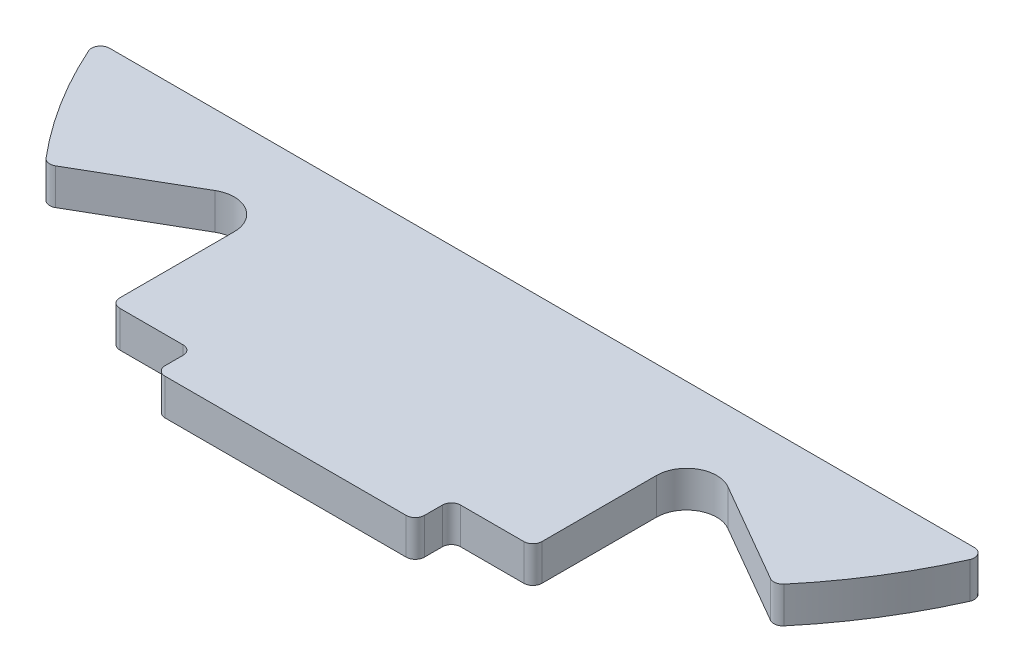
ISO-10303-21;
HEADER;
FILE_DESCRIPTION(('STEP AP214'),'2;1');
FILE_NAME('part.step','',(''),(''),'','','');
FILE_SCHEMA(('AUTOMOTIVE_DESIGN { 1 0 10303 214 1 1 1 1 }'));
ENDSEC;
DATA;
#1=APPLICATION_CONTEXT('core data for automotive mechanical design processes');
#2=APPLICATION_PROTOCOL_DEFINITION('international standard','automotive_design',2000,#1);
#3=PRODUCT_CONTEXT('',#1,'mechanical');
#4=PRODUCT('Part','Part','',(#3));
#5=PRODUCT_RELATED_PRODUCT_CATEGORY('part','',(#4));
#6=PRODUCT_DEFINITION_FORMATION('','',#4);
#7=PRODUCT_DEFINITION_CONTEXT('part definition',#1,'design');
#8=PRODUCT_DEFINITION('design','',#6,#7);
#9=PRODUCT_DEFINITION_SHAPE('','',#8);
#10=(LENGTH_UNIT() NAMED_UNIT(*) SI_UNIT(.MILLI.,.METRE.));
#11=(NAMED_UNIT(*) PLANE_ANGLE_UNIT() SI_UNIT($,.RADIAN.));
#12=(NAMED_UNIT(*) SI_UNIT($,.STERADIAN.) SOLID_ANGLE_UNIT());
#13=UNCERTAINTY_MEASURE_WITH_UNIT(LENGTH_MEASURE(1.E-05),#10,'distance_accuracy_value','');
#14=(GEOMETRIC_REPRESENTATION_CONTEXT(3) GLOBAL_UNCERTAINTY_ASSIGNED_CONTEXT((#13)) GLOBAL_UNIT_ASSIGNED_CONTEXT((#10,
#11,#12)) REPRESENTATION_CONTEXT('',''));
#15=CARTESIAN_POINT('',(0.,0.,0.));
#16=DIRECTION('',(0.,0.,1.));
#17=DIRECTION('',(1.,0.,0.));
#18=AXIS2_PLACEMENT_3D('',#15,#16,#17);
#19=CARTESIAN_POINT('',(43.,12.,0.));
#20=DIRECTION('',(0.,0.,-1.));
#21=DIRECTION('',(-1.,0.,0.));
#22=AXIS2_PLACEMENT_3D('',#19,#20,#21);
#23=PLANE('',#22);
#24=DIRECTION('',(1.,0.,0.));
#25=VECTOR('',#24,1.);
#26=CARTESIAN_POINT('',(43.,0.,0.));
#27=LINE('',#26,#25);
#28=CARTESIAN_POINT('',(-40.,0.,0.));
#29=VERTEX_POINT('',#28);
#30=CARTESIAN_POINT('',(40.,0.,0.));
#31=VERTEX_POINT('',#30);
#32=EDGE_CURVE('E288',#29,#31,#27,.T.);
#33=ORIENTED_EDGE('',*,*,#32,.T.);
#34=DIRECTION('',(0.,-1.,0.));
#35=VECTOR('',#34,1.);
#36=CARTESIAN_POINT('',(40.,12.,0.));
#37=LINE('',#36,#35);
#38=CARTESIAN_POINT('',(40.,12.,0.));
#39=VERTEX_POINT('',#38);
#40=EDGE_CURVE('E371',#31,#39,#37,.F.);
#41=ORIENTED_EDGE('',*,*,#40,.T.);
#42=DIRECTION('',(1.,0.,0.));
#43=VECTOR('',#42,1.);
#44=CARTESIAN_POINT('',(43.,12.,0.));
#45=LINE('',#44,#43);
#46=CARTESIAN_POINT('',(-40.,12.,0.));
#47=VERTEX_POINT('',#46);
#48=EDGE_CURVE('E289',#47,#39,#45,.T.);
#49=ORIENTED_EDGE('',*,*,#48,.F.);
#50=DIRECTION('',(0.,-1.,0.));
#51=VECTOR('',#50,1.);
#52=CARTESIAN_POINT('',(-40.,12.,0.));
#53=LINE('',#52,#51);
#54=EDGE_CURVE('E281',#29,#47,#53,.F.);
#55=ORIENTED_EDGE('',*,*,#54,.F.);
#56=EDGE_LOOP('',(#33,#41,#49,#55));
#57=FACE_BOUND('',#56,.T.);
#58=ADVANCED_FACE('F38',(#57),#23,.F.);
#59=CARTESIAN_POINT('',(43.,12.,-12.));
#60=DIRECTION('',(-1.,0.,0.));
#61=DIRECTION('',(0.,0.,1.));
#62=AXIS2_PLACEMENT_3D('',#59,#60,#61);
#63=PLANE('',#62);
#64=DIRECTION('',(0.,0.,-1.));
#65=VECTOR('',#64,1.);
#66=CARTESIAN_POINT('',(43.,0.,-12.));
#67=LINE('',#66,#65);
#68=CARTESIAN_POINT('',(43.,0.,-3.));
#69=VERTEX_POINT('',#68);
#70=CARTESIAN_POINT('',(43.,0.,-9.));
#71=VERTEX_POINT('',#70);
#72=EDGE_CURVE('E310',#69,#71,#67,.T.);
#73=ORIENTED_EDGE('',*,*,#72,.T.);
#74=DIRECTION('',(0.,-1.,0.));
#75=VECTOR('',#74,1.);
#76=CARTESIAN_POINT('',(43.,12.,-9.));
#77=LINE('',#76,#75);
#78=CARTESIAN_POINT('',(43.,12.,-9.));
#79=VERTEX_POINT('',#78);
#80=EDGE_CURVE('E369',#71,#79,#77,.F.);
#81=ORIENTED_EDGE('',*,*,#80,.T.);
#82=DIRECTION('',(0.,0.,-1.));
#83=VECTOR('',#82,1.);
#84=CARTESIAN_POINT('',(43.,12.,-12.));
#85=LINE('',#84,#83);
#86=CARTESIAN_POINT('',(43.,12.,-3.));
#87=VERTEX_POINT('',#86);
#88=EDGE_CURVE('E292',#87,#79,#85,.T.);
#89=ORIENTED_EDGE('',*,*,#88,.F.);
#90=DIRECTION('',(0.,-1.,0.));
#91=VECTOR('',#90,1.);
#92=CARTESIAN_POINT('',(43.,12.,-3.));
#93=LINE('',#92,#91);
#94=EDGE_CURVE('E366',#87,#69,#93,.T.);
#95=ORIENTED_EDGE('',*,*,#94,.T.);
#96=EDGE_LOOP('',(#73,#81,#89,#95));
#97=FACE_BOUND('',#96,.T.);
#98=ADVANCED_FACE('F378',(#97),#63,.F.);
#99=CARTESIAN_POINT('',(70.,12.,-12.));
#100=DIRECTION('',(0.,0.,-1.));
#101=DIRECTION('',(-1.,0.,0.));
#102=AXIS2_PLACEMENT_3D('',#99,#100,#101);
#103=PLANE('',#102);
#104=DIRECTION('',(1.,0.,0.));
#105=VECTOR('',#104,1.);
#106=CARTESIAN_POINT('',(70.,0.,-12.));
#107=LINE('',#106,#105);
#108=CARTESIAN_POINT('',(46.,0.,-12.));
#109=VERTEX_POINT('',#108);
#110=CARTESIAN_POINT('',(67.,0.,-12.));
#111=VERTEX_POINT('',#110);
#112=EDGE_CURVE('E313',#109,#111,#107,.T.);
#113=ORIENTED_EDGE('',*,*,#112,.T.);
#114=DIRECTION('',(0.,-1.,0.));
#115=VECTOR('',#114,1.);
#116=CARTESIAN_POINT('',(67.,12.,-12.));
#117=LINE('',#116,#115);
#118=CARTESIAN_POINT('',(67.,12.,-12.));
#119=VERTEX_POINT('',#118);
#120=EDGE_CURVE('E364',#111,#119,#117,.F.);
#121=ORIENTED_EDGE('',*,*,#120,.T.);
#122=DIRECTION('',(1.,0.,0.));
#123=VECTOR('',#122,1.);
#124=CARTESIAN_POINT('',(70.,12.,-12.));
#125=LINE('',#124,#123);
#126=CARTESIAN_POINT('',(46.,12.,-12.));
#127=VERTEX_POINT('',#126);
#128=EDGE_CURVE('E296',#127,#119,#125,.T.);
#129=ORIENTED_EDGE('',*,*,#128,.F.);
#130=DIRECTION('',(0.,-1.,0.));
#131=VECTOR('',#130,1.);
#132=CARTESIAN_POINT('',(46.,0.,-12.));
#133=LINE('',#132,#131);
#134=EDGE_CURVE('E361',#127,#109,#133,.T.);
#135=ORIENTED_EDGE('',*,*,#134,.T.);
#136=EDGE_LOOP('',(#113,#121,#129,#135));
#137=FACE_BOUND('',#136,.T.);
#138=ADVANCED_FACE('F386',(#137),#103,.F.);
#139=CARTESIAN_POINT('',(70.,12.,-12.));
#140=DIRECTION('',(-1.,0.,0.));
#141=DIRECTION('',(0.,0.,1.));
#142=AXIS2_PLACEMENT_3D('',#139,#140,#141);
#143=PLANE('',#142);
#144=DIRECTION('',(0.,0.,-1.));
#145=VECTOR('',#144,1.);
#146=CARTESIAN_POINT('',(70.,12.,-12.));
#147=LINE('',#146,#145);
#148=CARTESIAN_POINT('',(70.,12.,-15.));
#149=VERTEX_POINT('',#148);
#150=CARTESIAN_POINT('',(70.,12.,-52.9667186354589));
#151=VERTEX_POINT('',#150);
#152=EDGE_CURVE('E298',#149,#151,#147,.T.);
#153=ORIENTED_EDGE('',*,*,#152,.F.);
#154=DIRECTION('',(0.,-1.,0.));
#155=VECTOR('',#154,1.);
#156=CARTESIAN_POINT('',(70.,12.,-15.));
#157=LINE('',#156,#155);
#158=CARTESIAN_POINT('',(70.,0.,-15.));
#159=VERTEX_POINT('',#158);
#160=EDGE_CURVE('E358',#149,#159,#157,.T.);
#161=ORIENTED_EDGE('',*,*,#160,.T.);
#162=DIRECTION('',(0.,0.,-1.));
#163=VECTOR('',#162,1.);
#164=CARTESIAN_POINT('',(70.,0.,-12.));
#165=LINE('',#164,#163);
#166=CARTESIAN_POINT('',(70.,0.,-52.9667186354589));
#167=VERTEX_POINT('',#166);
#168=EDGE_CURVE('E316',#159,#167,#165,.T.);
#169=ORIENTED_EDGE('',*,*,#168,.T.);
#170=DIRECTION('',(0.,-1.,0.));
#171=VECTOR('',#170,1.);
#172=CARTESIAN_POINT('',(70.,12.,-52.9667186354589));
#173=LINE('',#172,#171);
#174=EDGE_CURVE('E326',#167,#151,#173,.F.);
#175=ORIENTED_EDGE('',*,*,#174,.T.);
#176=EDGE_LOOP('',(#153,#161,#169,#175));
#177=FACE_BOUND('',#176,.T.);
#178=ADVANCED_FACE('F393',(#177),#143,.F.);
#179=CARTESIAN_POINT('',(120.726964676496,12.,-41.));
#180=DIRECTION('',(0.499999999999998,0.,-0.86602540378444));
#181=DIRECTION('',(-0.86602540378444,0.,-0.499999999999998));
#182=AXIS2_PLACEMENT_3D('',#179,#180,#181);
#183=PLANE('',#182);
#184=DIRECTION('',(0.86602540378444,0.,0.499999999999998));
#185=VECTOR('',#184,1.);
#186=CARTESIAN_POINT('',(120.726964676496,0.,-41.));
#187=LINE('',#186,#185);
#188=CARTESIAN_POINT('',(85.,0.,-61.6269726733033));
#189=VERTEX_POINT('',#188);
#190=CARTESIAN_POINT('',(118.568704129067,0.,-42.2460723080397));
#191=VERTEX_POINT('',#190);
#192=EDGE_CURVE('E318',#189,#191,#187,.T.);
#193=ORIENTED_EDGE('',*,*,#192,.T.);
#194=DIRECTION('',(0.,-1.,0.));
#195=VECTOR('',#194,1.);
#196=CARTESIAN_POINT('',(118.568704129067,12.,-42.2460723080397));
#197=LINE('',#196,#195);
#198=CARTESIAN_POINT('',(118.568704129067,12.,-42.2460723080397));
#199=VERTEX_POINT('',#198);
#200=EDGE_CURVE('E53',#191,#199,#197,.F.);
#201=ORIENTED_EDGE('',*,*,#200,.T.);
#202=DIRECTION('',(0.86602540378444,0.,0.499999999999998));
#203=VECTOR('',#202,1.);
#204=CARTESIAN_POINT('',(120.726964676496,12.,-41.));
#205=LINE('',#204,#203);
#206=CARTESIAN_POINT('',(85.,12.,-61.6269726733033));
#207=VERTEX_POINT('',#206);
#208=EDGE_CURVE('E300',#207,#199,#205,.T.);
#209=ORIENTED_EDGE('',*,*,#208,.F.);
#210=DIRECTION('',(0.,-1.,0.));
#211=VECTOR('',#210,1.);
#212=CARTESIAN_POINT('',(85.,0.,-61.6269726733033));
#213=LINE('',#212,#211);
#214=EDGE_CURVE('E307',#207,#189,#213,.T.);
#215=ORIENTED_EDGE('',*,*,#214,.T.);
#216=EDGE_LOOP('',(#193,#201,#209,#215));
#217=FACE_BOUND('',#216,.T.);
#218=ADVANCED_FACE('F401',(#217),#183,.F.);
#219=CARTESIAN_POINT('',(0.,12.,-146.));
#220=DIRECTION('',(0.,-1.,0.));
#221=DIRECTION('',(0.,0.,-1.));
#222=AXIS2_PLACEMENT_3D('',#219,#220,#221);
#223=CYLINDRICAL_SURFACE('',#222,160.);
#224=CARTESIAN_POINT('',(0.,0.,-146.));
#225=DIRECTION('',(0.,1.,0.));
#226=DIRECTION('',(0.,0.,1.));
#227=AXIS2_PLACEMENT_3D('',#224,#225,#226);
#228=CIRCLE('',#227,160.);
#229=CARTESIAN_POINT('',(122.363010577393,0.,-42.911234159891));
#230=VERTEX_POINT('',#229);
#231=CARTESIAN_POINT('',(146.10259891776,0.,-80.7770700636942));
#232=VERTEX_POINT('',#231);
#233=EDGE_CURVE('E320',#230,#232,#228,.T.);
#234=ORIENTED_EDGE('',*,*,#233,.T.);
#235=DIRECTION('',(0.,-1.,0.));
#236=VECTOR('',#235,1.);
#237=CARTESIAN_POINT('',(146.10259891776,12.,-80.7770700636942));
#238=LINE('',#237,#236);
#239=CARTESIAN_POINT('',(146.10259891776,12.,-80.7770700636942));
#240=VERTEX_POINT('',#239);
#241=EDGE_CURVE('E348',#232,#240,#238,.F.);
#242=ORIENTED_EDGE('',*,*,#241,.T.);
#243=CARTESIAN_POINT('',(0.,12.,-146.));
#244=DIRECTION('',(0.,1.,0.));
#245=DIRECTION('',(0.,0.,1.));
#246=AXIS2_PLACEMENT_3D('',#243,#244,#245);
#247=CIRCLE('',#246,160.);
#248=CARTESIAN_POINT('',(122.363010577393,12.,-42.911234159891));
#249=VERTEX_POINT('',#248);
#250=EDGE_CURVE('E302',#249,#240,#247,.T.);
#251=ORIENTED_EDGE('',*,*,#250,.F.);
#252=DIRECTION('',(0.,-1.,0.));
#253=VECTOR('',#252,1.);
#254=CARTESIAN_POINT('',(122.363010577393,12.,-42.911234159891));
#255=LINE('',#254,#253);
#256=EDGE_CURVE('E345',#249,#230,#255,.T.);
#257=ORIENTED_EDGE('',*,*,#256,.T.);
#258=EDGE_LOOP('',(#234,#242,#251,#257));
#259=FACE_BOUND('',#258,.T.);
#260=ADVANCED_FACE('F408',(#259),#223,.T.);
#261=CARTESIAN_POINT('',(0.,12.,-85.));
#262=DIRECTION('',(0.,0.,1.));
#263=DIRECTION('',(1.,0.,0.));
#264=AXIS2_PLACEMENT_3D('',#261,#262,#263);
#265=PLANE('',#264);
#266=DIRECTION('',(-1.,0.,0.));
#267=VECTOR('',#266,1.);
#268=CARTESIAN_POINT('',(0.,12.,-85.));
#269=LINE('',#268,#267);
#270=CARTESIAN_POINT('',(143.363175188052,12.,-85.));
#271=VERTEX_POINT('',#270);
#272=CARTESIAN_POINT('',(-143.363175188052,12.,-85.));
#273=VERTEX_POINT('',#272);
#274=EDGE_CURVE('E305',#271,#273,#269,.T.);
#275=ORIENTED_EDGE('',*,*,#274,.F.);
#276=DIRECTION('',(0.,-1.,0.));
#277=VECTOR('',#276,1.);
#278=CARTESIAN_POINT('',(143.363175188052,12.,-85.));
#279=LINE('',#278,#277);
#280=CARTESIAN_POINT('',(143.363175188052,0.,-85.));
#281=VERTEX_POINT('',#280);
#282=EDGE_CURVE('E334',#271,#281,#279,.T.);
#283=ORIENTED_EDGE('',*,*,#282,.T.);
#284=DIRECTION('',(-1.,0.,0.));
#285=VECTOR('',#284,1.);
#286=CARTESIAN_POINT('',(0.,0.,-85.));
#287=LINE('',#286,#285);
#288=CARTESIAN_POINT('',(-143.363175188052,0.,-85.));
#289=VERTEX_POINT('',#288);
#290=EDGE_CURVE('E293',#281,#289,#287,.T.);
#291=ORIENTED_EDGE('',*,*,#290,.T.);
#292=DIRECTION('',(0.,-1.,0.));
#293=VECTOR('',#292,1.);
#294=CARTESIAN_POINT('',(-143.363175188052,12.,-85.));
#295=LINE('',#294,#293);
#296=EDGE_CURVE('E238',#273,#289,#295,.T.);
#297=ORIENTED_EDGE('',*,*,#296,.F.);
#298=EDGE_LOOP('',(#275,#283,#291,#297));
#299=FACE_BOUND('',#298,.T.);
#300=ADVANCED_FACE('F417',(#299),#265,.F.);
#301=CARTESIAN_POINT('',(0.,12.,-146.));
#302=DIRECTION('',(0.,1.,0.));
#303=DIRECTION('',(0.,0.,1.));
#304=AXIS2_PLACEMENT_3D('',#301,#302,#303);
#305=PLANE('',#304);
#306=ORIENTED_EDGE('',*,*,#250,.T.);
#307=CARTESIAN_POINT('',(143.363175188052,12.,-82.));
#308=DIRECTION('',(0.,1.,0.));
#309=DIRECTION('',(0.,0.,1.));
#310=AXIS2_PLACEMENT_3D('',#307,#308,#309);
#311=CIRCLE('',#310,3.);
#312=EDGE_CURVE('E355',#240,#271,#311,.T.);
#313=ORIENTED_EDGE('',*,*,#312,.T.);
#314=ORIENTED_EDGE('',*,*,#274,.T.);
#315=CARTESIAN_POINT('',(-143.363175188052,12.,-82.));
#316=DIRECTION('',(0.,-1.,0.));
#317=DIRECTION('',(0.,0.,1.));
#318=AXIS2_PLACEMENT_3D('',#315,#316,#317);
#319=CIRCLE('',#318,3.);
#320=CARTESIAN_POINT('',(-146.10259891776,12.,-80.7770700636942));
#321=VERTEX_POINT('',#320);
#322=EDGE_CURVE('E262',#321,#273,#319,.T.);
#323=ORIENTED_EDGE('',*,*,#322,.F.);
#324=CARTESIAN_POINT('',(0.,12.,-146.));
#325=DIRECTION('',(0.,-1.,0.));
#326=DIRECTION('',(0.,0.,1.));
#327=AXIS2_PLACEMENT_3D('',#324,#325,#326);
#328=CIRCLE('',#327,160.);
#329=CARTESIAN_POINT('',(-122.363010577393,12.,-42.911234159891));
#330=VERTEX_POINT('',#329);
#331=EDGE_CURVE('E221',#330,#321,#328,.T.);
#332=ORIENTED_EDGE('',*,*,#331,.F.);
#333=CARTESIAN_POINT('',(-120.068704129067,12.,-44.8441485193931));
#334=DIRECTION('',(0.,-1.,0.));
#335=DIRECTION('',(0.,0.,1.));
#336=AXIS2_PLACEMENT_3D('',#333,#334,#335);
#337=CIRCLE('',#336,3.);
#338=CARTESIAN_POINT('',(-118.568704129067,12.,-42.2460723080397));
#339=VERTEX_POINT('',#338);
#340=EDGE_CURVE('E260',#339,#330,#337,.T.);
#341=ORIENTED_EDGE('',*,*,#340,.F.);
#342=DIRECTION('',(-0.86602540378444,0.,0.499999999999998));
#343=VECTOR('',#342,1.);
#344=CARTESIAN_POINT('',(-120.726964676496,12.,-41.));
#345=LINE('',#344,#343);
#346=CARTESIAN_POINT('',(-85.,12.,-61.6269726733033));
#347=VERTEX_POINT('',#346);
#348=EDGE_CURVE('E426',#347,#339,#345,.T.);
#349=ORIENTED_EDGE('',*,*,#348,.F.);
#350=CARTESIAN_POINT('',(-80.,12.,-52.9667186354589));
#351=DIRECTION('',(0.,-1.,0.));
#352=DIRECTION('',(0.,0.,1.));
#353=AXIS2_PLACEMENT_3D('',#350,#351,#352);
#354=CIRCLE('',#353,10.);
#355=CARTESIAN_POINT('',(-70.,12.,-52.9667186354589));
#356=VERTEX_POINT('',#355);
#357=EDGE_CURVE('E212',#356,#347,#354,.F.);
#358=ORIENTED_EDGE('',*,*,#357,.F.);
#359=DIRECTION('',(0.,0.,-1.));
#360=VECTOR('',#359,1.);
#361=CARTESIAN_POINT('',(-70.,12.,-12.));
#362=LINE('',#361,#360);
#363=CARTESIAN_POINT('',(-70.,12.,-15.));
#364=VERTEX_POINT('',#363);
#365=EDGE_CURVE('E432',#364,#356,#362,.T.);
#366=ORIENTED_EDGE('',*,*,#365,.F.);
#367=CARTESIAN_POINT('',(-67.,12.,-15.));
#368=DIRECTION('',(0.,-1.,0.));
#369=DIRECTION('',(0.,0.,1.));
#370=AXIS2_PLACEMENT_3D('',#367,#368,#369);
#371=CIRCLE('',#370,3.);
#372=CARTESIAN_POINT('',(-67.,12.,-12.));
#373=VERTEX_POINT('',#372);
#374=EDGE_CURVE('E258',#373,#364,#371,.T.);
#375=ORIENTED_EDGE('',*,*,#374,.F.);
#376=DIRECTION('',(-1.,0.,0.));
#377=VECTOR('',#376,1.);
#378=CARTESIAN_POINT('',(-70.,12.,-12.));
#379=LINE('',#378,#377);
#380=CARTESIAN_POINT('',(-46.,12.,-12.));
#381=VERTEX_POINT('',#380);
#382=EDGE_CURVE('E435',#381,#373,#379,.T.);
#383=ORIENTED_EDGE('',*,*,#382,.F.);
#384=CARTESIAN_POINT('',(-46.,12.,-9.));
#385=DIRECTION('',(0.,-1.,0.));
#386=DIRECTION('',(0.,0.,1.));
#387=AXIS2_PLACEMENT_3D('',#384,#385,#386);
#388=CIRCLE('',#387,3.);
#389=CARTESIAN_POINT('',(-43.,12.,-9.));
#390=VERTEX_POINT('',#389);
#391=EDGE_CURVE('E286',#390,#381,#388,.F.);
#392=ORIENTED_EDGE('',*,*,#391,.F.);
#393=DIRECTION('',(0.,0.,-1.));
#394=VECTOR('',#393,1.);
#395=CARTESIAN_POINT('',(-43.,12.,-12.));
#396=LINE('',#395,#394);
#397=CARTESIAN_POINT('',(-43.,12.,-3.));
#398=VERTEX_POINT('',#397);
#399=EDGE_CURVE('E230',#398,#390,#396,.T.);
#400=ORIENTED_EDGE('',*,*,#399,.F.);
#401=CARTESIAN_POINT('',(-40.,12.,-3.));
#402=DIRECTION('',(0.,-1.,0.));
#403=DIRECTION('',(0.,0.,1.));
#404=AXIS2_PLACEMENT_3D('',#401,#402,#403);
#405=CIRCLE('',#404,3.);
#406=EDGE_CURVE('E256',#47,#398,#405,.T.);
#407=ORIENTED_EDGE('',*,*,#406,.F.);
#408=ORIENTED_EDGE('',*,*,#48,.T.);
#409=CARTESIAN_POINT('',(40.,12.,-3.));
#410=DIRECTION('',(0.,1.,0.));
#411=DIRECTION('',(0.,0.,1.));
#412=AXIS2_PLACEMENT_3D('',#409,#410,#411);
#413=CIRCLE('',#412,3.);
#414=EDGE_CURVE('E350',#39,#87,#413,.T.);
#415=ORIENTED_EDGE('',*,*,#414,.T.);
#416=ORIENTED_EDGE('',*,*,#88,.T.);
#417=CARTESIAN_POINT('',(46.,12.,-9.));
#418=DIRECTION('',(0.,1.,0.));
#419=DIRECTION('',(0.,0.,1.));
#420=AXIS2_PLACEMENT_3D('',#417,#418,#419);
#421=CIRCLE('',#420,3.);
#422=EDGE_CURVE('E11',#79,#127,#421,.F.);
#423=ORIENTED_EDGE('',*,*,#422,.T.);
#424=ORIENTED_EDGE('',*,*,#128,.T.);
#425=CARTESIAN_POINT('',(67.,12.,-15.));
#426=DIRECTION('',(0.,1.,0.));
#427=DIRECTION('',(0.,0.,1.));
#428=AXIS2_PLACEMENT_3D('',#425,#426,#427);
#429=CIRCLE('',#428,3.);
#430=EDGE_CURVE('E61',#119,#149,#429,.T.);
#431=ORIENTED_EDGE('',*,*,#430,.T.);
#432=ORIENTED_EDGE('',*,*,#152,.T.);
#433=CARTESIAN_POINT('',(80.,12.,-52.9667186354589));
#434=DIRECTION('',(0.,1.,0.));
#435=DIRECTION('',(0.,0.,1.));
#436=AXIS2_PLACEMENT_3D('',#433,#434,#435);
#437=CIRCLE('',#436,10.);
#438=EDGE_CURVE('E332',#151,#207,#437,.F.);
#439=ORIENTED_EDGE('',*,*,#438,.T.);
#440=ORIENTED_EDGE('',*,*,#208,.T.);
#441=CARTESIAN_POINT('',(120.068704129067,12.,-44.8441485193931));
#442=DIRECTION('',(0.,1.,0.));
#443=DIRECTION('',(0.,0.,1.));
#444=AXIS2_PLACEMENT_3D('',#441,#442,#443);
#445=CIRCLE('',#444,3.);
#446=EDGE_CURVE('E353',#199,#249,#445,.T.);
#447=ORIENTED_EDGE('',*,*,#446,.T.);
#448=EDGE_LOOP('',(#306,#313,#314,#323,#332,#341,#349,#358,#366,#375,#383,#392,#400,#407,#408,
#415,#416,#423,#424,#431,#432,#439,#440,#447));
#449=FACE_BOUND('',#448,.T.);
#450=ADVANCED_FACE('F384',(#449),#305,.T.);
#451=CARTESIAN_POINT('',(0.,0.,-146.));
#452=DIRECTION('',(0.,1.,0.));
#453=DIRECTION('',(0.,0.,1.));
#454=AXIS2_PLACEMENT_3D('',#451,#452,#453);
#455=PLANE('',#454);
#456=ORIENTED_EDGE('',*,*,#290,.F.);
#457=CARTESIAN_POINT('',(143.363175188052,0.,-82.));
#458=DIRECTION('',(0.,1.,0.));
#459=DIRECTION('',(0.,0.,1.));
#460=AXIS2_PLACEMENT_3D('',#457,#458,#459);
#461=CIRCLE('',#460,3.);
#462=EDGE_CURVE('E343',#281,#232,#461,.F.);
#463=ORIENTED_EDGE('',*,*,#462,.T.);
#464=ORIENTED_EDGE('',*,*,#233,.F.);
#465=CARTESIAN_POINT('',(120.068704129067,0.,-44.8441485193931));
#466=DIRECTION('',(0.,1.,0.));
#467=DIRECTION('',(0.,0.,1.));
#468=AXIS2_PLACEMENT_3D('',#465,#466,#467);
#469=CIRCLE('',#468,3.);
#470=EDGE_CURVE('E341',#230,#191,#469,.F.);
#471=ORIENTED_EDGE('',*,*,#470,.T.);
#472=ORIENTED_EDGE('',*,*,#192,.F.);
#473=CARTESIAN_POINT('',(80.,0.,-52.9667186354589));
#474=DIRECTION('',(0.,1.,0.));
#475=DIRECTION('',(0.,0.,1.));
#476=AXIS2_PLACEMENT_3D('',#473,#474,#475);
#477=CIRCLE('',#476,10.);
#478=EDGE_CURVE('E329',#189,#167,#477,.T.);
#479=ORIENTED_EDGE('',*,*,#478,.T.);
#480=ORIENTED_EDGE('',*,*,#168,.F.);
#481=CARTESIAN_POINT('',(67.,0.,-15.));
#482=DIRECTION('',(0.,1.,0.));
#483=DIRECTION('',(0.,0.,1.));
#484=AXIS2_PLACEMENT_3D('',#481,#482,#483);
#485=CIRCLE('',#484,3.);
#486=EDGE_CURVE('E339',#159,#111,#485,.F.);
#487=ORIENTED_EDGE('',*,*,#486,.T.);
#488=ORIENTED_EDGE('',*,*,#112,.F.);
#489=CARTESIAN_POINT('',(46.,0.,-9.));
#490=DIRECTION('',(0.,1.,0.));
#491=DIRECTION('',(0.,0.,1.));
#492=AXIS2_PLACEMENT_3D('',#489,#490,#491);
#493=CIRCLE('',#492,3.);
#494=EDGE_CURVE('E46',#109,#71,#493,.T.);
#495=ORIENTED_EDGE('',*,*,#494,.T.);
#496=ORIENTED_EDGE('',*,*,#72,.F.);
#497=CARTESIAN_POINT('',(40.,0.,-3.));
#498=DIRECTION('',(0.,1.,0.));
#499=DIRECTION('',(0.,0.,1.));
#500=AXIS2_PLACEMENT_3D('',#497,#498,#499);
#501=CIRCLE('',#500,3.);
#502=EDGE_CURVE('E337',#69,#31,#501,.F.);
#503=ORIENTED_EDGE('',*,*,#502,.T.);
#504=ORIENTED_EDGE('',*,*,#32,.F.);
#505=CARTESIAN_POINT('',(-40.,0.,-3.));
#506=DIRECTION('',(0.,-1.,0.));
#507=DIRECTION('',(0.,0.,1.));
#508=AXIS2_PLACEMENT_3D('',#505,#506,#507);
#509=CIRCLE('',#508,3.);
#510=CARTESIAN_POINT('',(-43.,0.,-3.));
#511=VERTEX_POINT('',#510);
#512=EDGE_CURVE('E241',#511,#29,#509,.F.);
#513=ORIENTED_EDGE('',*,*,#512,.F.);
#514=DIRECTION('',(0.,0.,-1.));
#515=VECTOR('',#514,1.);
#516=CARTESIAN_POINT('',(-43.,0.,-12.));
#517=LINE('',#516,#515);
#518=CARTESIAN_POINT('',(-43.,0.,-9.));
#519=VERTEX_POINT('',#518);
#520=EDGE_CURVE('E439',#511,#519,#517,.T.);
#521=ORIENTED_EDGE('',*,*,#520,.T.);
#522=CARTESIAN_POINT('',(-46.,0.,-9.));
#523=DIRECTION('',(0.,-1.,0.));
#524=DIRECTION('',(0.,0.,1.));
#525=AXIS2_PLACEMENT_3D('',#522,#523,#524);
#526=CIRCLE('',#525,3.);
#527=CARTESIAN_POINT('',(-46.,0.,-12.));
#528=VERTEX_POINT('',#527);
#529=EDGE_CURVE('E284',#528,#519,#526,.T.);
#530=ORIENTED_EDGE('',*,*,#529,.F.);
#531=DIRECTION('',(-1.,0.,0.));
#532=VECTOR('',#531,1.);
#533=CARTESIAN_POINT('',(-70.,0.,-12.));
#534=LINE('',#533,#532);
#535=CARTESIAN_POINT('',(-67.,0.,-12.));
#536=VERTEX_POINT('',#535);
#537=EDGE_CURVE('E232',#528,#536,#534,.T.);
#538=ORIENTED_EDGE('',*,*,#537,.T.);
#539=CARTESIAN_POINT('',(-67.,0.,-15.));
#540=DIRECTION('',(0.,-1.,0.));
#541=DIRECTION('',(0.,0.,1.));
#542=AXIS2_PLACEMENT_3D('',#539,#540,#541);
#543=CIRCLE('',#542,3.);
#544=CARTESIAN_POINT('',(-70.,0.,-15.));
#545=VERTEX_POINT('',#544);
#546=EDGE_CURVE('E244',#545,#536,#543,.F.);
#547=ORIENTED_EDGE('',*,*,#546,.F.);
#548=DIRECTION('',(0.,0.,-1.));
#549=VECTOR('',#548,1.);
#550=CARTESIAN_POINT('',(-70.,0.,-12.));
#551=LINE('',#550,#549);
#552=CARTESIAN_POINT('',(-70.,0.,-52.9667186354589));
#553=VERTEX_POINT('',#552);
#554=EDGE_CURVE('E208',#545,#553,#551,.T.);
#555=ORIENTED_EDGE('',*,*,#554,.T.);
#556=CARTESIAN_POINT('',(-80.,0.,-52.9667186354589));
#557=DIRECTION('',(0.,-1.,0.));
#558=DIRECTION('',(0.,0.,1.));
#559=AXIS2_PLACEMENT_3D('',#556,#557,#558);
#560=CIRCLE('',#559,10.);
#561=CARTESIAN_POINT('',(-85.,0.,-61.6269726733033));
#562=VERTEX_POINT('',#561);
#563=EDGE_CURVE('E201',#562,#553,#560,.T.);
#564=ORIENTED_EDGE('',*,*,#563,.F.);
#565=DIRECTION('',(-0.86602540378444,0.,0.499999999999998));
#566=VECTOR('',#565,1.);
#567=CARTESIAN_POINT('',(-120.726964676496,0.,-41.));
#568=LINE('',#567,#566);
#569=CARTESIAN_POINT('',(-118.568704129067,0.,-42.2460723080397));
#570=VERTEX_POINT('',#569);
#571=EDGE_CURVE('E206',#562,#570,#568,.T.);
#572=ORIENTED_EDGE('',*,*,#571,.T.);
#573=CARTESIAN_POINT('',(-120.068704129067,0.,-44.8441485193931));
#574=DIRECTION('',(0.,-1.,0.));
#575=DIRECTION('',(0.,0.,1.));
#576=AXIS2_PLACEMENT_3D('',#573,#574,#575);
#577=CIRCLE('',#576,3.);
#578=CARTESIAN_POINT('',(-122.363010577393,0.,-42.911234159891));
#579=VERTEX_POINT('',#578);
#580=EDGE_CURVE('E246',#579,#570,#577,.F.);
#581=ORIENTED_EDGE('',*,*,#580,.F.);
#582=CARTESIAN_POINT('',(0.,0.,-146.));
#583=DIRECTION('',(0.,-1.,0.));
#584=DIRECTION('',(0.,0.,1.));
#585=AXIS2_PLACEMENT_3D('',#582,#583,#584);
#586=CIRCLE('',#585,160.);
#587=CARTESIAN_POINT('',(-146.10259891776,0.,-80.7770700636942));
#588=VERTEX_POINT('',#587);
#589=EDGE_CURVE('E227',#579,#588,#586,.T.);
#590=ORIENTED_EDGE('',*,*,#589,.T.);
#591=CARTESIAN_POINT('',(-143.363175188052,0.,-82.));
#592=DIRECTION('',(0.,-1.,0.));
#593=DIRECTION('',(0.,0.,1.));
#594=AXIS2_PLACEMENT_3D('',#591,#592,#593);
#595=CIRCLE('',#594,3.);
#596=EDGE_CURVE('E248',#289,#588,#595,.F.);
#597=ORIENTED_EDGE('',*,*,#596,.F.);
#598=EDGE_LOOP('',(#456,#463,#464,#471,#472,#479,#480,#487,#488,#495,#496,#503,#504,#513,#521,
#530,#538,#547,#555,#564,#572,#581,#590,#597));
#599=FACE_BOUND('',#598,.T.);
#600=ADVANCED_FACE('F204',(#599),#455,.F.);
#601=CARTESIAN_POINT('',(80.,12.,-52.9667186354589));
#602=DIRECTION('',(0.,1.,0.));
#603=DIRECTION('',(0.,0.,1.));
#604=AXIS2_PLACEMENT_3D('',#601,#602,#603);
#605=CYLINDRICAL_SURFACE('',#604,10.);
#606=ORIENTED_EDGE('',*,*,#438,.F.);
#607=ORIENTED_EDGE('',*,*,#174,.F.);
#608=ORIENTED_EDGE('',*,*,#478,.F.);
#609=ORIENTED_EDGE('',*,*,#214,.F.);
#610=EDGE_LOOP('',(#606,#607,#608,#609));
#611=FACE_BOUND('',#610,.T.);
#612=ADVANCED_FACE('F399',(#611),#605,.F.);
#613=CARTESIAN_POINT('',(143.363175188052,12.,-82.));
#614=DIRECTION('',(0.,-1.,0.));
#615=DIRECTION('',(0.,0.,-1.));
#616=AXIS2_PLACEMENT_3D('',#613,#614,#615);
#617=CYLINDRICAL_SURFACE('',#616,3.);
#618=ORIENTED_EDGE('',*,*,#312,.F.);
#619=ORIENTED_EDGE('',*,*,#241,.F.);
#620=ORIENTED_EDGE('',*,*,#462,.F.);
#621=ORIENTED_EDGE('',*,*,#282,.F.);
#622=EDGE_LOOP('',(#618,#619,#620,#621));
#623=FACE_BOUND('',#622,.T.);
#624=ADVANCED_FACE('F412',(#623),#617,.T.);
#625=CARTESIAN_POINT('',(120.068704129067,12.,-44.8441485193931));
#626=DIRECTION('',(0.,-1.,0.));
#627=DIRECTION('',(0.,0.,-1.));
#628=AXIS2_PLACEMENT_3D('',#625,#626,#627);
#629=CYLINDRICAL_SURFACE('',#628,3.);
#630=ORIENTED_EDGE('',*,*,#446,.F.);
#631=ORIENTED_EDGE('',*,*,#200,.F.);
#632=ORIENTED_EDGE('',*,*,#470,.F.);
#633=ORIENTED_EDGE('',*,*,#256,.F.);
#634=EDGE_LOOP('',(#630,#631,#632,#633));
#635=FACE_BOUND('',#634,.T.);
#636=ADVANCED_FACE('F403',(#635),#629,.T.);
#637=CARTESIAN_POINT('',(67.,12.,-15.));
#638=DIRECTION('',(0.,-1.,0.));
#639=DIRECTION('',(0.,0.,-1.));
#640=AXIS2_PLACEMENT_3D('',#637,#638,#639);
#641=CYLINDRICAL_SURFACE('',#640,3.);
#642=ORIENTED_EDGE('',*,*,#430,.F.);
#643=ORIENTED_EDGE('',*,*,#120,.F.);
#644=ORIENTED_EDGE('',*,*,#486,.F.);
#645=ORIENTED_EDGE('',*,*,#160,.F.);
#646=EDGE_LOOP('',(#642,#643,#644,#645));
#647=FACE_BOUND('',#646,.T.);
#648=ADVANCED_FACE('F389',(#647),#641,.T.);
#649=CARTESIAN_POINT('',(46.,12.,-9.));
#650=DIRECTION('',(0.,1.,0.));
#651=DIRECTION('',(0.,0.,1.));
#652=AXIS2_PLACEMENT_3D('',#649,#650,#651);
#653=CYLINDRICAL_SURFACE('',#652,3.);
#654=ORIENTED_EDGE('',*,*,#422,.F.);
#655=ORIENTED_EDGE('',*,*,#80,.F.);
#656=ORIENTED_EDGE('',*,*,#494,.F.);
#657=ORIENTED_EDGE('',*,*,#134,.F.);
#658=EDGE_LOOP('',(#654,#655,#656,#657));
#659=FACE_BOUND('',#658,.T.);
#660=ADVANCED_FACE('F382',(#659),#653,.F.);
#661=CARTESIAN_POINT('',(40.,12.,-3.));
#662=DIRECTION('',(0.,-1.,0.));
#663=DIRECTION('',(0.,0.,-1.));
#664=AXIS2_PLACEMENT_3D('',#661,#662,#663);
#665=CYLINDRICAL_SURFACE('',#664,3.);
#666=ORIENTED_EDGE('',*,*,#414,.F.);
#667=ORIENTED_EDGE('',*,*,#40,.F.);
#668=ORIENTED_EDGE('',*,*,#502,.F.);
#669=ORIENTED_EDGE('',*,*,#94,.F.);
#670=EDGE_LOOP('',(#666,#667,#668,#669));
#671=FACE_BOUND('',#670,.T.);
#672=ADVANCED_FACE('F40',(#671),#665,.T.);
#673=CARTESIAN_POINT('',(-43.,12.,-12.));
#674=DIRECTION('',(1.,0.,0.));
#675=DIRECTION('',(0.,0.,1.));
#676=AXIS2_PLACEMENT_3D('',#673,#674,#675);
#677=PLANE('',#676);
#678=ORIENTED_EDGE('',*,*,#520,.F.);
#679=DIRECTION('',(0.,-1.,0.));
#680=VECTOR('',#679,1.);
#681=CARTESIAN_POINT('',(-43.,12.,-3.));
#682=LINE('',#681,#680);
#683=EDGE_CURVE('E275',#398,#511,#682,.T.);
#684=ORIENTED_EDGE('',*,*,#683,.F.);
#685=ORIENTED_EDGE('',*,*,#399,.T.);
#686=DIRECTION('',(0.,-1.,0.));
#687=VECTOR('',#686,1.);
#688=CARTESIAN_POINT('',(-43.,12.,-9.));
#689=LINE('',#688,#687);
#690=EDGE_CURVE('E278',#519,#390,#689,.F.);
#691=ORIENTED_EDGE('',*,*,#690,.F.);
#692=EDGE_LOOP('',(#678,#684,#685,#691));
#693=FACE_BOUND('',#692,.T.);
#694=ADVANCED_FACE('F462',(#693),#677,.F.);
#695=CARTESIAN_POINT('',(-70.,12.,-12.));
#696=DIRECTION('',(0.,0.,-1.));
#697=DIRECTION('',(1.,0.,0.));
#698=AXIS2_PLACEMENT_3D('',#695,#696,#697);
#699=PLANE('',#698);
#700=ORIENTED_EDGE('',*,*,#537,.F.);
#701=DIRECTION('',(0.,-1.,0.));
#702=VECTOR('',#701,1.);
#703=CARTESIAN_POINT('',(-46.,0.,-12.));
#704=LINE('',#703,#702);
#705=EDGE_CURVE('E269',#381,#528,#704,.T.);
#706=ORIENTED_EDGE('',*,*,#705,.F.);
#707=ORIENTED_EDGE('',*,*,#382,.T.);
#708=DIRECTION('',(0.,-1.,0.));
#709=VECTOR('',#708,1.);
#710=CARTESIAN_POINT('',(-67.,12.,-12.));
#711=LINE('',#710,#709);
#712=EDGE_CURVE('E272',#536,#373,#711,.F.);
#713=ORIENTED_EDGE('',*,*,#712,.F.);
#714=EDGE_LOOP('',(#700,#706,#707,#713));
#715=FACE_BOUND('',#714,.T.);
#716=ADVANCED_FACE('F446',(#715),#699,.F.);
#717=CARTESIAN_POINT('',(-70.,12.,-12.));
#718=DIRECTION('',(1.,0.,0.));
#719=DIRECTION('',(0.,0.,1.));
#720=AXIS2_PLACEMENT_3D('',#717,#718,#719);
#721=PLANE('',#720);
#722=ORIENTED_EDGE('',*,*,#365,.T.);
#723=DIRECTION('',(0.,-1.,0.));
#724=VECTOR('',#723,1.);
#725=CARTESIAN_POINT('',(-70.,12.,-52.9667186354589));
#726=LINE('',#725,#724);
#727=EDGE_CURVE('E213',#553,#356,#726,.F.);
#728=ORIENTED_EDGE('',*,*,#727,.F.);
#729=ORIENTED_EDGE('',*,*,#554,.F.);
#730=DIRECTION('',(0.,-1.,0.));
#731=VECTOR('',#730,1.);
#732=CARTESIAN_POINT('',(-70.,12.,-15.));
#733=LINE('',#732,#731);
#734=EDGE_CURVE('E266',#364,#545,#733,.T.);
#735=ORIENTED_EDGE('',*,*,#734,.F.);
#736=EDGE_LOOP('',(#722,#728,#729,#735));
#737=FACE_BOUND('',#736,.T.);
#738=ADVANCED_FACE('F454',(#737),#721,.F.);
#739=CARTESIAN_POINT('',(-120.726964676496,12.,-41.));
#740=DIRECTION('',(-0.499999999999998,0.,-0.86602540378444));
#741=DIRECTION('',(0.86602540378444,0.,-0.499999999999998));
#742=AXIS2_PLACEMENT_3D('',#739,#740,#741);
#743=PLANE('',#742);
#744=ORIENTED_EDGE('',*,*,#571,.F.);
#745=DIRECTION('',(0.,-1.,0.));
#746=VECTOR('',#745,1.);
#747=CARTESIAN_POINT('',(-85.,0.,-61.6269726733033));
#748=LINE('',#747,#746);
#749=EDGE_CURVE('E216',#347,#562,#748,.T.);
#750=ORIENTED_EDGE('',*,*,#749,.F.);
#751=ORIENTED_EDGE('',*,*,#348,.T.);
#752=DIRECTION('',(0.,-1.,0.));
#753=VECTOR('',#752,1.);
#754=CARTESIAN_POINT('',(-118.568704129067,12.,-42.2460723080397));
#755=LINE('',#754,#753);
#756=EDGE_CURVE('E226',#570,#339,#755,.F.);
#757=ORIENTED_EDGE('',*,*,#756,.F.);
#758=EDGE_LOOP('',(#744,#750,#751,#757));
#759=FACE_BOUND('',#758,.T.);
#760=ADVANCED_FACE('F224',(#759),#743,.F.);
#761=CARTESIAN_POINT('',(0.,12.,-146.));
#762=DIRECTION('',(0.,-1.,0.));
#763=DIRECTION('',(0.,0.,-1.));
#764=AXIS2_PLACEMENT_3D('',#761,#762,#763);
#765=CYLINDRICAL_SURFACE('',#764,160.);
#766=ORIENTED_EDGE('',*,*,#589,.F.);
#767=DIRECTION('',(0.,-1.,0.));
#768=VECTOR('',#767,1.);
#769=CARTESIAN_POINT('',(-122.363010577393,12.,-42.911234159891));
#770=LINE('',#769,#768);
#771=EDGE_CURVE('E250',#330,#579,#770,.T.);
#772=ORIENTED_EDGE('',*,*,#771,.F.);
#773=ORIENTED_EDGE('',*,*,#331,.T.);
#774=DIRECTION('',(0.,-1.,0.));
#775=VECTOR('',#774,1.);
#776=CARTESIAN_POINT('',(-146.10259891776,12.,-80.7770700636942));
#777=LINE('',#776,#775);
#778=EDGE_CURVE('E253',#588,#321,#777,.F.);
#779=ORIENTED_EDGE('',*,*,#778,.F.);
#780=EDGE_LOOP('',(#766,#772,#773,#779));
#781=FACE_BOUND('',#780,.T.);
#782=ADVANCED_FACE('F429',(#781),#765,.T.);
#783=CARTESIAN_POINT('',(-80.,12.,-52.9667186354589));
#784=DIRECTION('',(0.,1.,0.));
#785=DIRECTION('',(0.,0.,1.));
#786=AXIS2_PLACEMENT_3D('',#783,#784,#785);
#787=CYLINDRICAL_SURFACE('',#786,10.);
#788=ORIENTED_EDGE('',*,*,#357,.T.);
#789=ORIENTED_EDGE('',*,*,#749,.T.);
#790=ORIENTED_EDGE('',*,*,#563,.T.);
#791=ORIENTED_EDGE('',*,*,#727,.T.);
#792=EDGE_LOOP('',(#788,#789,#790,#791));
#793=FACE_BOUND('',#792,.T.);
#794=ADVANCED_FACE('F217',(#793),#787,.F.);
#795=CARTESIAN_POINT('',(-143.363175188052,12.,-82.));
#796=DIRECTION('',(0.,-1.,0.));
#797=DIRECTION('',(0.,0.,-1.));
#798=AXIS2_PLACEMENT_3D('',#795,#796,#797);
#799=CYLINDRICAL_SURFACE('',#798,3.);
#800=ORIENTED_EDGE('',*,*,#322,.T.);
#801=ORIENTED_EDGE('',*,*,#296,.T.);
#802=ORIENTED_EDGE('',*,*,#596,.T.);
#803=ORIENTED_EDGE('',*,*,#778,.T.);
#804=EDGE_LOOP('',(#800,#801,#802,#803));
#805=FACE_BOUND('',#804,.T.);
#806=ADVANCED_FACE('F420',(#805),#799,.T.);
#807=CARTESIAN_POINT('',(-120.068704129067,12.,-44.8441485193931));
#808=DIRECTION('',(0.,-1.,0.));
#809=DIRECTION('',(0.,0.,-1.));
#810=AXIS2_PLACEMENT_3D('',#807,#808,#809);
#811=CYLINDRICAL_SURFACE('',#810,3.);
#812=ORIENTED_EDGE('',*,*,#340,.T.);
#813=ORIENTED_EDGE('',*,*,#771,.T.);
#814=ORIENTED_EDGE('',*,*,#580,.T.);
#815=ORIENTED_EDGE('',*,*,#756,.T.);
#816=EDGE_LOOP('',(#812,#813,#814,#815));
#817=FACE_BOUND('',#816,.T.);
#818=ADVANCED_FACE('F431',(#817),#811,.T.);
#819=CARTESIAN_POINT('',(-67.,12.,-15.));
#820=DIRECTION('',(0.,-1.,0.));
#821=DIRECTION('',(0.,0.,-1.));
#822=AXIS2_PLACEMENT_3D('',#819,#820,#821);
#823=CYLINDRICAL_SURFACE('',#822,3.);
#824=ORIENTED_EDGE('',*,*,#374,.T.);
#825=ORIENTED_EDGE('',*,*,#734,.T.);
#826=ORIENTED_EDGE('',*,*,#546,.T.);
#827=ORIENTED_EDGE('',*,*,#712,.T.);
#828=EDGE_LOOP('',(#824,#825,#826,#827));
#829=FACE_BOUND('',#828,.T.);
#830=ADVANCED_FACE('F450',(#829),#823,.T.);
#831=CARTESIAN_POINT('',(-46.,12.,-9.));
#832=DIRECTION('',(0.,1.,0.));
#833=DIRECTION('',(0.,0.,1.));
#834=AXIS2_PLACEMENT_3D('',#831,#832,#833);
#835=CYLINDRICAL_SURFACE('',#834,3.);
#836=ORIENTED_EDGE('',*,*,#391,.T.);
#837=ORIENTED_EDGE('',*,*,#705,.T.);
#838=ORIENTED_EDGE('',*,*,#529,.T.);
#839=ORIENTED_EDGE('',*,*,#690,.T.);
#840=EDGE_LOOP('',(#836,#837,#838,#839));
#841=FACE_BOUND('',#840,.T.);
#842=ADVANCED_FACE('F674',(#841),#835,.F.);
#843=CARTESIAN_POINT('',(-40.,12.,-3.));
#844=DIRECTION('',(0.,-1.,0.));
#845=DIRECTION('',(0.,0.,-1.));
#846=AXIS2_PLACEMENT_3D('',#843,#844,#845);
#847=CYLINDRICAL_SURFACE('',#846,3.);
#848=ORIENTED_EDGE('',*,*,#406,.T.);
#849=ORIENTED_EDGE('',*,*,#683,.T.);
#850=ORIENTED_EDGE('',*,*,#512,.T.);
#851=ORIENTED_EDGE('',*,*,#54,.T.);
#852=EDGE_LOOP('',(#848,#849,#850,#851));
#853=FACE_BOUND('',#852,.T.);
#854=ADVANCED_FACE('F467',(#853),#847,.T.);
#855=CLOSED_SHELL('',(#58,#98,#138,#178,#218,#260,#300,#450,#600,#612,#624,#636,#648,#660,#672,
#694,#716,#738,#760,#782,#794,#806,#818,#830,#842,#854));
#856=MANIFOLD_SOLID_BREP('B2',#855);
#857=ADVANCED_BREP_SHAPE_REPRESENTATION('',(#18,#856),#14);
#858=SHAPE_DEFINITION_REPRESENTATION(#9,#857);
ENDSEC;
END-ISO-10303-21;
